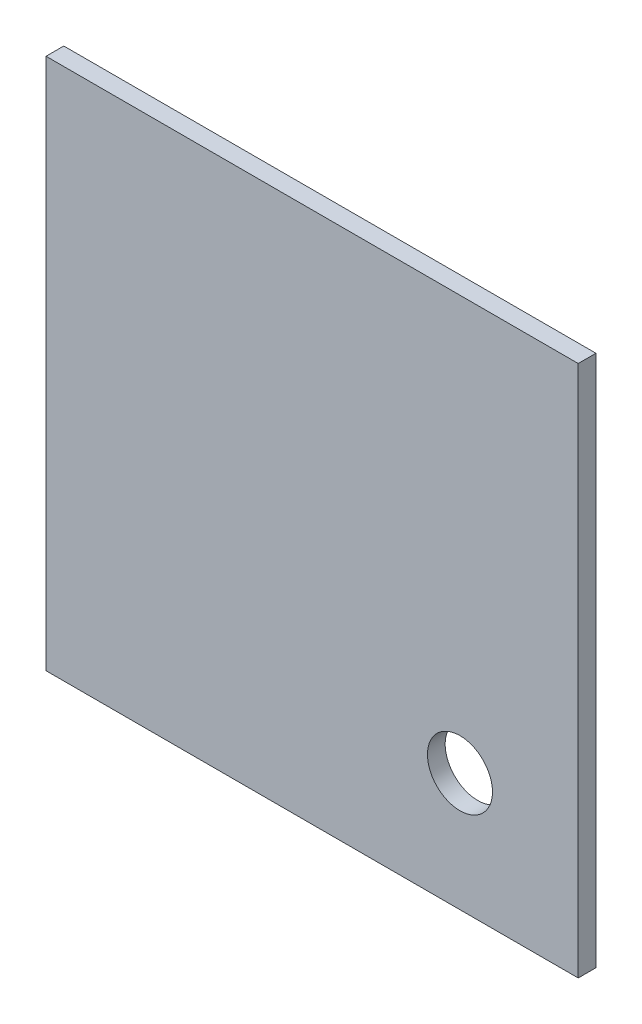
ISO-10303-21;
HEADER;
FILE_DESCRIPTION(('STEP AP214'),'2;1');
FILE_NAME('part.step','',(''),(''),'','','');
FILE_SCHEMA(('AUTOMOTIVE_DESIGN { 1 0 10303 214 1 1 1 1 }'));
ENDSEC;
DATA;
#1=APPLICATION_CONTEXT('core data for automotive mechanical design processes');
#2=APPLICATION_PROTOCOL_DEFINITION('international standard','automotive_design',2000,#1);
#3=PRODUCT_CONTEXT('',#1,'mechanical');
#4=PRODUCT('Part','Part','',(#3));
#5=PRODUCT_RELATED_PRODUCT_CATEGORY('part','',(#4));
#6=PRODUCT_DEFINITION_FORMATION('','',#4);
#7=PRODUCT_DEFINITION_CONTEXT('part definition',#1,'design');
#8=PRODUCT_DEFINITION('design','',#6,#7);
#9=PRODUCT_DEFINITION_SHAPE('','',#8);
#10=(LENGTH_UNIT() NAMED_UNIT(*) SI_UNIT(.MILLI.,.METRE.));
#11=(NAMED_UNIT(*) PLANE_ANGLE_UNIT() SI_UNIT($,.RADIAN.));
#12=(NAMED_UNIT(*) SI_UNIT($,.STERADIAN.) SOLID_ANGLE_UNIT());
#13=UNCERTAINTY_MEASURE_WITH_UNIT(LENGTH_MEASURE(1.E-05),#10,'distance_accuracy_value','');
#14=(GEOMETRIC_REPRESENTATION_CONTEXT(3) GLOBAL_UNCERTAINTY_ASSIGNED_CONTEXT((#13)) GLOBAL_UNIT_ASSIGNED_CONTEXT((#10,
#11,#12)) REPRESENTATION_CONTEXT('',''));
#15=CARTESIAN_POINT('',(0.,0.,0.));
#16=DIRECTION('',(0.,0.,1.));
#17=DIRECTION('',(1.,0.,0.));
#18=AXIS2_PLACEMENT_3D('',#15,#16,#17);
#19=CARTESIAN_POINT('',(0.,0.,3.));
#20=DIRECTION('',(0.,0.,1.));
#21=DIRECTION('',(1.,0.,0.));
#22=AXIS2_PLACEMENT_3D('',#19,#20,#21);
#23=PLANE('',#22);
#24=DIRECTION('',(0.,-1.,0.));
#25=VECTOR('',#24,1.);
#26=CARTESIAN_POINT('',(-45.,-45.,3.));
#27=LINE('',#26,#25);
#28=CARTESIAN_POINT('',(-45.,45.,3.));
#29=VERTEX_POINT('',#28);
#30=CARTESIAN_POINT('',(-45.,-45.,3.));
#31=VERTEX_POINT('',#30);
#32=EDGE_CURVE('E89',#29,#31,#27,.T.);
#33=ORIENTED_EDGE('',*,*,#32,.T.);
#34=DIRECTION('',(1.,0.,0.));
#35=VECTOR('',#34,1.);
#36=CARTESIAN_POINT('',(45.,-45.,3.));
#37=LINE('',#36,#35);
#38=CARTESIAN_POINT('',(45.,-45.,3.));
#39=VERTEX_POINT('',#38);
#40=EDGE_CURVE('E84',#31,#39,#37,.T.);
#41=ORIENTED_EDGE('',*,*,#40,.T.);
#42=DIRECTION('',(0.,1.,0.));
#43=VECTOR('',#42,1.);
#44=CARTESIAN_POINT('',(45.,-45.,3.));
#45=LINE('',#44,#43);
#46=CARTESIAN_POINT('',(45.,45.,3.));
#47=VERTEX_POINT('',#46);
#48=EDGE_CURVE('E87',#39,#47,#45,.T.);
#49=ORIENTED_EDGE('',*,*,#48,.T.);
#50=DIRECTION('',(-1.,0.,0.));
#51=VECTOR('',#50,1.);
#52=CARTESIAN_POINT('',(45.,45.,3.));
#53=LINE('',#52,#51);
#54=EDGE_CURVE('E54',#47,#29,#53,.T.);
#55=ORIENTED_EDGE('',*,*,#54,.T.);
#56=EDGE_LOOP('',(#33,#41,#49,#55));
#57=FACE_BOUND('',#56,.T.);
#58=CARTESIAN_POINT('',(25.,-25.,3.));
#59=DIRECTION('',(0.,0.,1.));
#60=DIRECTION('',(1.,0.,0.));
#61=AXIS2_PLACEMENT_3D('',#58,#59,#60);
#62=CIRCLE('',#61,5.5);
#63=CARTESIAN_POINT('',(30.5,-25.,3.));
#64=VERTEX_POINT('',#63);
#65=EDGE_CURVE('E104',#64,#64,#62,.T.);
#66=ORIENTED_EDGE('',*,*,#65,.F.);
#67=EDGE_LOOP('',(#66));
#68=FACE_BOUND('',#67,.T.);
#69=ADVANCED_FACE('F37',(#57,#68),#23,.T.);
#70=CARTESIAN_POINT('',(0.,0.,0.));
#71=DIRECTION('',(0.,0.,1.));
#72=DIRECTION('',(1.,0.,0.));
#73=AXIS2_PLACEMENT_3D('',#70,#71,#72);
#74=PLANE('',#73);
#75=DIRECTION('',(0.,-1.,0.));
#76=VECTOR('',#75,1.);
#77=CARTESIAN_POINT('',(-45.,-45.,0.));
#78=LINE('',#77,#76);
#79=CARTESIAN_POINT('',(-45.,45.,0.));
#80=VERTEX_POINT('',#79);
#81=CARTESIAN_POINT('',(-45.,-45.,0.));
#82=VERTEX_POINT('',#81);
#83=EDGE_CURVE('E101',#80,#82,#78,.T.);
#84=ORIENTED_EDGE('',*,*,#83,.F.);
#85=DIRECTION('',(-1.,0.,0.));
#86=VECTOR('',#85,1.);
#87=CARTESIAN_POINT('',(45.,45.,0.));
#88=LINE('',#87,#86);
#89=CARTESIAN_POINT('',(45.,45.,0.));
#90=VERTEX_POINT('',#89);
#91=EDGE_CURVE('E77',#90,#80,#88,.T.);
#92=ORIENTED_EDGE('',*,*,#91,.F.);
#93=DIRECTION('',(0.,1.,0.));
#94=VECTOR('',#93,1.);
#95=CARTESIAN_POINT('',(45.,-45.,0.));
#96=LINE('',#95,#94);
#97=CARTESIAN_POINT('',(45.,-45.,0.));
#98=VERTEX_POINT('',#97);
#99=EDGE_CURVE('E71',#98,#90,#96,.T.);
#100=ORIENTED_EDGE('',*,*,#99,.F.);
#101=DIRECTION('',(1.,0.,0.));
#102=VECTOR('',#101,1.);
#103=CARTESIAN_POINT('',(45.,-45.,0.));
#104=LINE('',#103,#102);
#105=EDGE_CURVE('E93',#82,#98,#104,.T.);
#106=ORIENTED_EDGE('',*,*,#105,.F.);
#107=EDGE_LOOP('',(#84,#92,#100,#106));
#108=FACE_BOUND('',#107,.T.);
#109=CARTESIAN_POINT('',(25.,-25.,0.));
#110=DIRECTION('',(0.,0.,1.));
#111=DIRECTION('',(1.,0.,0.));
#112=AXIS2_PLACEMENT_3D('',#109,#110,#111);
#113=CIRCLE('',#112,5.5);
#114=CARTESIAN_POINT('',(30.5,-25.,0.));
#115=VERTEX_POINT('',#114);
#116=EDGE_CURVE('E116',#115,#115,#113,.T.);
#117=ORIENTED_EDGE('',*,*,#116,.T.);
#118=EDGE_LOOP('',(#117));
#119=FACE_BOUND('',#118,.T.);
#120=ADVANCED_FACE('F112',(#108,#119),#74,.F.);
#121=CARTESIAN_POINT('',(-45.,-45.,3.));
#122=DIRECTION('',(1.,0.,0.));
#123=DIRECTION('',(0.,0.,-1.));
#124=AXIS2_PLACEMENT_3D('',#121,#122,#123);
#125=PLANE('',#124);
#126=ORIENTED_EDGE('',*,*,#83,.T.);
#127=DIRECTION('',(0.,0.,-1.));
#128=VECTOR('',#127,1.);
#129=CARTESIAN_POINT('',(-45.,-45.,3.));
#130=LINE('',#129,#128);
#131=EDGE_CURVE('E11',#31,#82,#130,.T.);
#132=ORIENTED_EDGE('',*,*,#131,.F.);
#133=ORIENTED_EDGE('',*,*,#32,.F.);
#134=DIRECTION('',(0.,0.,-1.));
#135=VECTOR('',#134,1.);
#136=CARTESIAN_POINT('',(-45.,45.,3.));
#137=LINE('',#136,#135);
#138=EDGE_CURVE('E97',#29,#80,#137,.T.);
#139=ORIENTED_EDGE('',*,*,#138,.T.);
#140=EDGE_LOOP('',(#126,#132,#133,#139));
#141=FACE_BOUND('',#140,.T.);
#142=ADVANCED_FACE('F39',(#141),#125,.F.);
#143=CARTESIAN_POINT('',(45.,-45.,3.));
#144=DIRECTION('',(0.,1.,0.));
#145=DIRECTION('',(-1.,0.,0.));
#146=AXIS2_PLACEMENT_3D('',#143,#144,#145);
#147=PLANE('',#146);
#148=ORIENTED_EDGE('',*,*,#105,.T.);
#149=DIRECTION('',(0.,0.,-1.));
#150=VECTOR('',#149,1.);
#151=CARTESIAN_POINT('',(45.,-45.,3.));
#152=LINE('',#151,#150);
#153=EDGE_CURVE('E46',#39,#98,#152,.T.);
#154=ORIENTED_EDGE('',*,*,#153,.F.);
#155=ORIENTED_EDGE('',*,*,#40,.F.);
#156=ORIENTED_EDGE('',*,*,#131,.T.);
#157=EDGE_LOOP('',(#148,#154,#155,#156));
#158=FACE_BOUND('',#157,.T.);
#159=ADVANCED_FACE('F92',(#158),#147,.F.);
#160=CARTESIAN_POINT('',(45.,-45.,3.));
#161=DIRECTION('',(-1.,0.,0.));
#162=DIRECTION('',(0.,0.,1.));
#163=AXIS2_PLACEMENT_3D('',#160,#161,#162);
#164=PLANE('',#163);
#165=ORIENTED_EDGE('',*,*,#99,.T.);
#166=DIRECTION('',(0.,0.,-1.));
#167=VECTOR('',#166,1.);
#168=CARTESIAN_POINT('',(45.,45.,3.));
#169=LINE('',#168,#167);
#170=EDGE_CURVE('E94',#47,#90,#169,.T.);
#171=ORIENTED_EDGE('',*,*,#170,.F.);
#172=ORIENTED_EDGE('',*,*,#48,.F.);
#173=ORIENTED_EDGE('',*,*,#153,.T.);
#174=EDGE_LOOP('',(#165,#171,#172,#173));
#175=FACE_BOUND('',#174,.T.);
#176=ADVANCED_FACE('F95',(#175),#164,.F.);
#177=CARTESIAN_POINT('',(45.,45.,3.));
#178=DIRECTION('',(0.,-1.,0.));
#179=DIRECTION('',(1.,0.,0.));
#180=AXIS2_PLACEMENT_3D('',#177,#178,#179);
#181=PLANE('',#180);
#182=ORIENTED_EDGE('',*,*,#91,.T.);
#183=ORIENTED_EDGE('',*,*,#138,.F.);
#184=ORIENTED_EDGE('',*,*,#54,.F.);
#185=ORIENTED_EDGE('',*,*,#170,.T.);
#186=EDGE_LOOP('',(#182,#183,#184,#185));
#187=FACE_BOUND('',#186,.T.);
#188=ADVANCED_FACE('F109',(#187),#181,.F.);
#189=CARTESIAN_POINT('',(25.,-25.,3.));
#190=DIRECTION('',(0.,0.,-1.));
#191=DIRECTION('',(-1.,0.,0.));
#192=AXIS2_PLACEMENT_3D('',#189,#190,#191);
#193=CYLINDRICAL_SURFACE('',#192,5.5);
#194=ORIENTED_EDGE('',*,*,#65,.T.);
#195=EDGE_LOOP('',(#194));
#196=FACE_BOUND('',#195,.T.);
#197=ORIENTED_EDGE('',*,*,#116,.F.);
#198=EDGE_LOOP('',(#197));
#199=FACE_BOUND('',#198,.T.);
#200=ADVANCED_FACE('F122',(#196,#199),#193,.F.);
#201=CLOSED_SHELL('',(#69,#120,#142,#159,#176,#188,#200));
#202=MANIFOLD_SOLID_BREP('B2',#201);
#203=ADVANCED_BREP_SHAPE_REPRESENTATION('',(#18,#202),#14);
#204=SHAPE_DEFINITION_REPRESENTATION(#9,#203);
ENDSEC;
END-ISO-10303-21;
